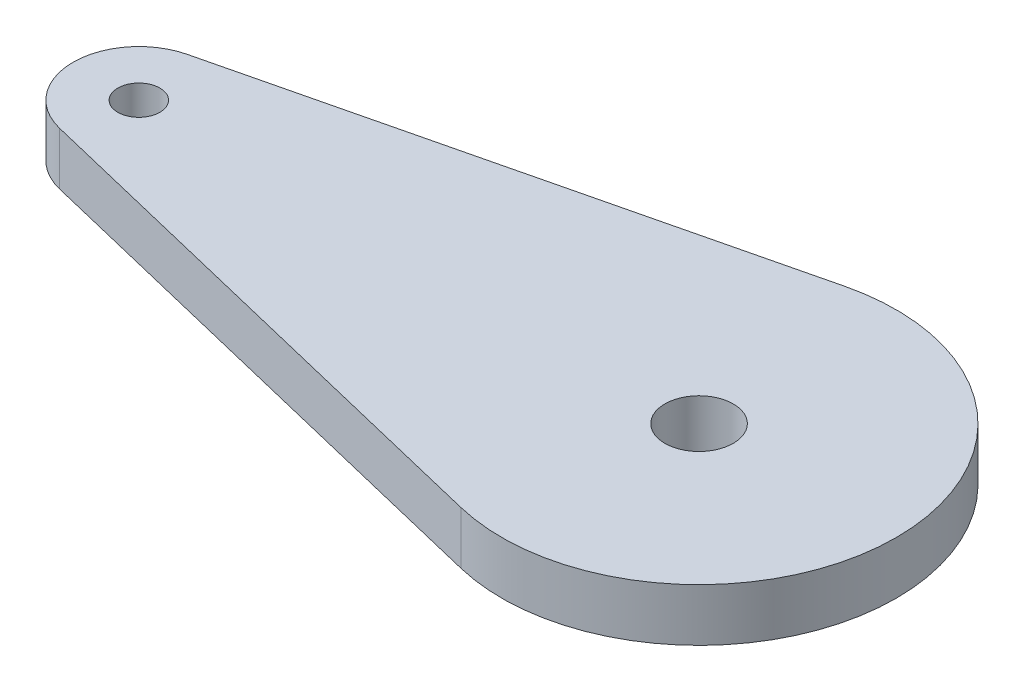
ISO-10303-21;
HEADER;
FILE_DESCRIPTION(('STEP AP214'),'2;1');
FILE_NAME('part.step','',(''),(''),'','','');
FILE_SCHEMA(('AUTOMOTIVE_DESIGN { 1 0 10303 214 1 1 1 1 }'));
ENDSEC;
DATA;
#1=APPLICATION_CONTEXT('core data for automotive mechanical design processes');
#2=APPLICATION_PROTOCOL_DEFINITION('international standard','automotive_design',2000,#1);
#3=PRODUCT_CONTEXT('',#1,'mechanical');
#4=PRODUCT('Part','Part','',(#3));
#5=PRODUCT_RELATED_PRODUCT_CATEGORY('part','',(#4));
#6=PRODUCT_DEFINITION_FORMATION('','',#4);
#7=PRODUCT_DEFINITION_CONTEXT('part definition',#1,'design');
#8=PRODUCT_DEFINITION('design','',#6,#7);
#9=PRODUCT_DEFINITION_SHAPE('','',#8);
#10=(LENGTH_UNIT() NAMED_UNIT(*) SI_UNIT(.MILLI.,.METRE.));
#11=(NAMED_UNIT(*) PLANE_ANGLE_UNIT() SI_UNIT($,.RADIAN.));
#12=(NAMED_UNIT(*) SI_UNIT($,.STERADIAN.) SOLID_ANGLE_UNIT());
#13=UNCERTAINTY_MEASURE_WITH_UNIT(LENGTH_MEASURE(1.E-05),#10,'distance_accuracy_value','');
#14=(GEOMETRIC_REPRESENTATION_CONTEXT(3) GLOBAL_UNCERTAINTY_ASSIGNED_CONTEXT((#13)) GLOBAL_UNIT_ASSIGNED_CONTEXT((#10,
#11,#12)) REPRESENTATION_CONTEXT('',''));
#15=CARTESIAN_POINT('',(0.,0.,0.));
#16=DIRECTION('',(0.,0.,1.));
#17=DIRECTION('',(1.,0.,0.));
#18=AXIS2_PLACEMENT_3D('',#15,#16,#17);
#19=CARTESIAN_POINT('',(42.6,4.,0.));
#20=DIRECTION('',(0.,1.,0.));
#21=DIRECTION('',(0.,0.,1.));
#22=AXIS2_PLACEMENT_3D('',#19,#20,#21);
#23=PLANE('',#22);
#24=CARTESIAN_POINT('',(0.,4.,0.));
#25=DIRECTION('',(0.,1.,0.));
#26=DIRECTION('',(0.,0.,1.));
#27=AXIS2_PLACEMENT_3D('',#24,#25,#26);
#28=CIRCLE('',#27,1.6);
#29=CARTESIAN_POINT('',(0.,4.,1.6));
#30=VERTEX_POINT('',#29);
#31=EDGE_CURVE('E100',#30,#30,#28,.T.);
#32=ORIENTED_EDGE('',*,*,#31,.F.);
#33=EDGE_LOOP('',(#32));
#34=FACE_BOUND('',#33,.T.);
#35=CARTESIAN_POINT('',(42.6,4.,0.));
#36=DIRECTION('',(0.,1.,0.));
#37=DIRECTION('',(0.,0.,1.));
#38=AXIS2_PLACEMENT_3D('',#35,#36,#37);
#39=CIRCLE('',#38,15.);
#40=CARTESIAN_POINT('',(39.0788732394366,4.,14.5808664466843));
#41=VERTEX_POINT('',#40);
#42=CARTESIAN_POINT('',(39.0788732394366,4.,-14.5808664466843));
#43=VERTEX_POINT('',#42);
#44=EDGE_CURVE('E85',#41,#43,#39,.T.);
#45=ORIENTED_EDGE('',*,*,#44,.T.);
#46=DIRECTION('',(-0.972057763112288,0.,0.234741784037559));
#47=VECTOR('',#46,1.);
#48=CARTESIAN_POINT('',(-1.17370892018779,4.,-4.86028881556144));
#49=LINE('',#48,#47);
#50=CARTESIAN_POINT('',(-1.17370892018779,4.,-4.86028881556144));
#51=VERTEX_POINT('',#50);
#52=EDGE_CURVE('E80',#43,#51,#49,.T.);
#53=ORIENTED_EDGE('',*,*,#52,.T.);
#54=CARTESIAN_POINT('',(0.,4.,0.));
#55=DIRECTION('',(0.,1.,0.));
#56=DIRECTION('',(0.,0.,1.));
#57=AXIS2_PLACEMENT_3D('',#54,#55,#56);
#58=CIRCLE('',#57,5.);
#59=CARTESIAN_POINT('',(-1.17370892018779,4.,4.86028881556143));
#60=VERTEX_POINT('',#59);
#61=EDGE_CURVE('E83',#51,#60,#58,.T.);
#62=ORIENTED_EDGE('',*,*,#61,.T.);
#63=DIRECTION('',(0.972057763112288,0.,0.234741784037559));
#64=VECTOR('',#63,1.);
#65=CARTESIAN_POINT('',(-1.17370892018779,4.,4.86028881556143));
#66=LINE('',#65,#64);
#67=EDGE_CURVE('E50',#60,#41,#66,.T.);
#68=ORIENTED_EDGE('',*,*,#67,.T.);
#69=EDGE_LOOP('',(#45,#53,#62,#68));
#70=FACE_BOUND('',#69,.T.);
#71=CARTESIAN_POINT('',(42.6,4.,0.));
#72=DIRECTION('',(0.,1.,0.));
#73=DIRECTION('',(0.,0.,1.));
#74=AXIS2_PLACEMENT_3D('',#71,#72,#73);
#75=CIRCLE('',#74,2.6);
#76=CARTESIAN_POINT('',(42.6,4.,2.6));
#77=VERTEX_POINT('',#76);
#78=EDGE_CURVE('E115',#77,#77,#75,.T.);
#79=ORIENTED_EDGE('',*,*,#78,.F.);
#80=EDGE_LOOP('',(#79));
#81=FACE_BOUND('',#80,.T.);
#82=ADVANCED_FACE('F33',(#34,#70,#81),#23,.T.);
#83=CARTESIAN_POINT('',(42.6,0.,0.));
#84=DIRECTION('',(0.,1.,0.));
#85=DIRECTION('',(0.,0.,1.));
#86=AXIS2_PLACEMENT_3D('',#83,#84,#85);
#87=PLANE('',#86);
#88=CARTESIAN_POINT('',(42.6,0.,0.));
#89=DIRECTION('',(0.,1.,0.));
#90=DIRECTION('',(0.,0.,1.));
#91=AXIS2_PLACEMENT_3D('',#88,#89,#90);
#92=CIRCLE('',#91,15.);
#93=CARTESIAN_POINT('',(39.0788732394366,0.,14.5808664466843));
#94=VERTEX_POINT('',#93);
#95=CARTESIAN_POINT('',(39.0788732394366,0.,-14.5808664466843));
#96=VERTEX_POINT('',#95);
#97=EDGE_CURVE('E97',#94,#96,#92,.T.);
#98=ORIENTED_EDGE('',*,*,#97,.F.);
#99=DIRECTION('',(0.972057763112288,0.,0.234741784037559));
#100=VECTOR('',#99,1.);
#101=CARTESIAN_POINT('',(-1.17370892018779,0.,4.86028881556143));
#102=LINE('',#101,#100);
#103=CARTESIAN_POINT('',(-1.17370892018779,0.,4.86028881556143));
#104=VERTEX_POINT('',#103);
#105=EDGE_CURVE('E73',#104,#94,#102,.T.);
#106=ORIENTED_EDGE('',*,*,#105,.F.);
#107=CARTESIAN_POINT('',(0.,0.,0.));
#108=DIRECTION('',(0.,1.,0.));
#109=DIRECTION('',(0.,0.,1.));
#110=AXIS2_PLACEMENT_3D('',#107,#108,#109);
#111=CIRCLE('',#110,5.);
#112=CARTESIAN_POINT('',(-1.17370892018779,0.,-4.86028881556144));
#113=VERTEX_POINT('',#112);
#114=EDGE_CURVE('E67',#113,#104,#111,.T.);
#115=ORIENTED_EDGE('',*,*,#114,.F.);
#116=DIRECTION('',(-0.972057763112288,0.,0.234741784037559));
#117=VECTOR('',#116,1.);
#118=CARTESIAN_POINT('',(-1.17370892018779,0.,-4.86028881556144));
#119=LINE('',#118,#117);
#120=EDGE_CURVE('E89',#96,#113,#119,.T.);
#121=ORIENTED_EDGE('',*,*,#120,.F.);
#122=EDGE_LOOP('',(#98,#106,#115,#121));
#123=FACE_BOUND('',#122,.T.);
#124=CARTESIAN_POINT('',(0.,0.,0.));
#125=DIRECTION('',(0.,1.,0.));
#126=DIRECTION('',(0.,0.,1.));
#127=AXIS2_PLACEMENT_3D('',#124,#125,#126);
#128=CIRCLE('',#127,1.6);
#129=CARTESIAN_POINT('',(0.,0.,1.6));
#130=VERTEX_POINT('',#129);
#131=EDGE_CURVE('E112',#130,#130,#128,.T.);
#132=ORIENTED_EDGE('',*,*,#131,.T.);
#133=EDGE_LOOP('',(#132));
#134=FACE_BOUND('',#133,.T.);
#135=CARTESIAN_POINT('',(42.6,0.,0.));
#136=DIRECTION('',(0.,1.,0.));
#137=DIRECTION('',(0.,0.,1.));
#138=AXIS2_PLACEMENT_3D('',#135,#136,#137);
#139=CIRCLE('',#138,2.6);
#140=CARTESIAN_POINT('',(42.6,0.,2.6));
#141=VERTEX_POINT('',#140);
#142=EDGE_CURVE('E118',#141,#141,#139,.T.);
#143=ORIENTED_EDGE('',*,*,#142,.T.);
#144=EDGE_LOOP('',(#143));
#145=FACE_BOUND('',#144,.T.);
#146=ADVANCED_FACE('F108',(#123,#134,#145),#87,.F.);
#147=CARTESIAN_POINT('',(42.6,4.,0.));
#148=DIRECTION('',(0.,-1.,0.));
#149=DIRECTION('',(0.,0.,-1.));
#150=AXIS2_PLACEMENT_3D('',#147,#148,#149);
#151=CYLINDRICAL_SURFACE('',#150,15.);
#152=ORIENTED_EDGE('',*,*,#97,.T.);
#153=DIRECTION('',(0.,-1.,0.));
#154=VECTOR('',#153,1.);
#155=CARTESIAN_POINT('',(39.0788732394366,4.,-14.5808664466843));
#156=LINE('',#155,#154);
#157=EDGE_CURVE('E11',#43,#96,#156,.T.);
#158=ORIENTED_EDGE('',*,*,#157,.F.);
#159=ORIENTED_EDGE('',*,*,#44,.F.);
#160=DIRECTION('',(0.,-1.,0.));
#161=VECTOR('',#160,1.);
#162=CARTESIAN_POINT('',(39.0788732394366,4.,14.5808664466843));
#163=LINE('',#162,#161);
#164=EDGE_CURVE('E93',#41,#94,#163,.T.);
#165=ORIENTED_EDGE('',*,*,#164,.T.);
#166=EDGE_LOOP('',(#152,#158,#159,#165));
#167=FACE_BOUND('',#166,.T.);
#168=ADVANCED_FACE('F35',(#167),#151,.T.);
#169=CARTESIAN_POINT('',(-1.17370892018779,4.,-4.86028881556144));
#170=DIRECTION('',(0.234741784037559,0.,0.972057763112288));
#171=DIRECTION('',(0.972057763112288,0.,-0.234741784037559));
#172=AXIS2_PLACEMENT_3D('',#169,#170,#171);
#173=PLANE('',#172);
#174=ORIENTED_EDGE('',*,*,#120,.T.);
#175=DIRECTION('',(0.,-1.,0.));
#176=VECTOR('',#175,1.);
#177=CARTESIAN_POINT('',(-1.17370892018779,4.,-4.86028881556144));
#178=LINE('',#177,#176);
#179=EDGE_CURVE('E42',#51,#113,#178,.T.);
#180=ORIENTED_EDGE('',*,*,#179,.F.);
#181=ORIENTED_EDGE('',*,*,#52,.F.);
#182=ORIENTED_EDGE('',*,*,#157,.T.);
#183=EDGE_LOOP('',(#174,#180,#181,#182));
#184=FACE_BOUND('',#183,.T.);
#185=ADVANCED_FACE('F88',(#184),#173,.F.);
#186=CARTESIAN_POINT('',(0.,4.,0.));
#187=DIRECTION('',(0.,-1.,0.));
#188=DIRECTION('',(0.,0.,-1.));
#189=AXIS2_PLACEMENT_3D('',#186,#187,#188);
#190=CYLINDRICAL_SURFACE('',#189,5.);
#191=ORIENTED_EDGE('',*,*,#114,.T.);
#192=DIRECTION('',(0.,-1.,0.));
#193=VECTOR('',#192,1.);
#194=CARTESIAN_POINT('',(-1.17370892018779,4.,4.86028881556143));
#195=LINE('',#194,#193);
#196=EDGE_CURVE('E90',#60,#104,#195,.T.);
#197=ORIENTED_EDGE('',*,*,#196,.F.);
#198=ORIENTED_EDGE('',*,*,#61,.F.);
#199=ORIENTED_EDGE('',*,*,#179,.T.);
#200=EDGE_LOOP('',(#191,#197,#198,#199));
#201=FACE_BOUND('',#200,.T.);
#202=ADVANCED_FACE('F91',(#201),#190,.T.);
#203=CARTESIAN_POINT('',(-1.17370892018779,4.,4.86028881556143));
#204=DIRECTION('',(0.234741784037559,0.,-0.972057763112288));
#205=DIRECTION('',(-0.972057763112288,0.,-0.234741784037559));
#206=AXIS2_PLACEMENT_3D('',#203,#204,#205);
#207=PLANE('',#206);
#208=ORIENTED_EDGE('',*,*,#105,.T.);
#209=ORIENTED_EDGE('',*,*,#164,.F.);
#210=ORIENTED_EDGE('',*,*,#67,.F.);
#211=ORIENTED_EDGE('',*,*,#196,.T.);
#212=EDGE_LOOP('',(#208,#209,#210,#211));
#213=FACE_BOUND('',#212,.T.);
#214=ADVANCED_FACE('F105',(#213),#207,.F.);
#215=CARTESIAN_POINT('',(0.,4.,0.));
#216=DIRECTION('',(0.,-1.,0.));
#217=DIRECTION('',(0.,0.,-1.));
#218=AXIS2_PLACEMENT_3D('',#215,#216,#217);
#219=CYLINDRICAL_SURFACE('',#218,1.6);
#220=ORIENTED_EDGE('',*,*,#31,.T.);
#221=EDGE_LOOP('',(#220));
#222=FACE_BOUND('',#221,.T.);
#223=ORIENTED_EDGE('',*,*,#131,.F.);
#224=EDGE_LOOP('',(#223));
#225=FACE_BOUND('',#224,.T.);
#226=ADVANCED_FACE('F135',(#222,#225),#219,.F.);
#227=CARTESIAN_POINT('',(42.6,4.,0.));
#228=DIRECTION('',(0.,-1.,0.));
#229=DIRECTION('',(0.,0.,-1.));
#230=AXIS2_PLACEMENT_3D('',#227,#228,#229);
#231=CYLINDRICAL_SURFACE('',#230,2.6);
#232=ORIENTED_EDGE('',*,*,#78,.T.);
#233=EDGE_LOOP('',(#232));
#234=FACE_BOUND('',#233,.T.);
#235=ORIENTED_EDGE('',*,*,#142,.F.);
#236=EDGE_LOOP('',(#235));
#237=FACE_BOUND('',#236,.T.);
#238=ADVANCED_FACE('F124',(#234,#237),#231,.F.);
#239=CLOSED_SHELL('',(#82,#146,#168,#185,#202,#214,#226,#238));
#240=MANIFOLD_SOLID_BREP('B2',#239);
#241=ADVANCED_BREP_SHAPE_REPRESENTATION('',(#18,#240),#14);
#242=SHAPE_DEFINITION_REPRESENTATION(#9,#241);
ENDSEC;
END-ISO-10303-21;
